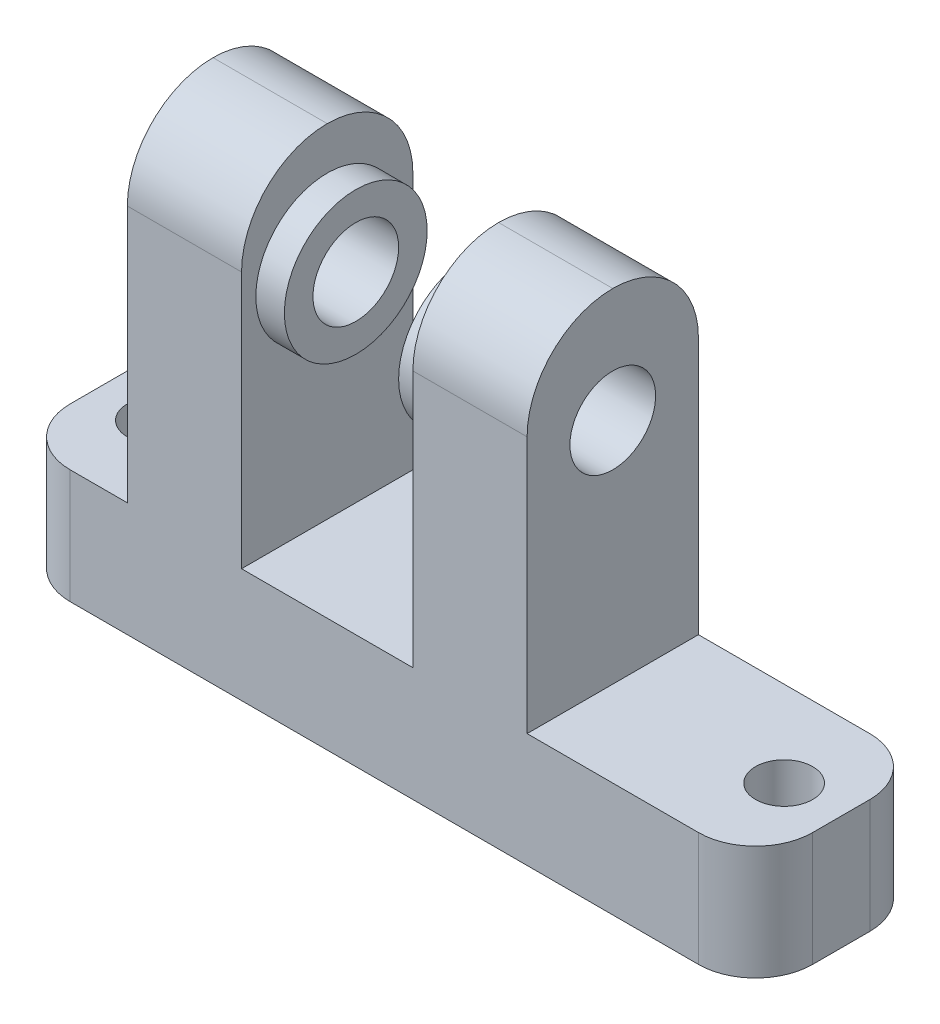
ISO-10303-21;
HEADER;
FILE_DESCRIPTION(('STEP AP214'),'2;1');
FILE_NAME('part.step','',(''),(''),'','','');
FILE_SCHEMA(('AUTOMOTIVE_DESIGN { 1 0 10303 214 1 1 1 1 }'));
ENDSEC;
DATA;
#1=APPLICATION_CONTEXT('core data for automotive mechanical design processes');
#2=APPLICATION_PROTOCOL_DEFINITION('international standard','automotive_design',2000,#1);
#3=PRODUCT_CONTEXT('',#1,'mechanical');
#4=PRODUCT('Part','Part','',(#3));
#5=PRODUCT_RELATED_PRODUCT_CATEGORY('part','',(#4));
#6=PRODUCT_DEFINITION_FORMATION('','',#4);
#7=PRODUCT_DEFINITION_CONTEXT('part definition',#1,'design');
#8=PRODUCT_DEFINITION('design','',#6,#7);
#9=PRODUCT_DEFINITION_SHAPE('','',#8);
#10=(LENGTH_UNIT() NAMED_UNIT(*) SI_UNIT(.MILLI.,.METRE.));
#11=(NAMED_UNIT(*) PLANE_ANGLE_UNIT() SI_UNIT($,.RADIAN.));
#12=(NAMED_UNIT(*) SI_UNIT($,.STERADIAN.) SOLID_ANGLE_UNIT());
#13=UNCERTAINTY_MEASURE_WITH_UNIT(LENGTH_MEASURE(1.E-05),#10,'distance_accuracy_value','');
#14=(GEOMETRIC_REPRESENTATION_CONTEXT(3) GLOBAL_UNCERTAINTY_ASSIGNED_CONTEXT((#13)) GLOBAL_UNIT_ASSIGNED_CONTEXT((#10,
#11,#12)) REPRESENTATION_CONTEXT('',''));
#15=CARTESIAN_POINT('',(0.,0.,0.));
#16=DIRECTION('',(0.,0.,1.));
#17=DIRECTION('',(1.,0.,0.));
#18=AXIS2_PLACEMENT_3D('',#15,#16,#17);
#19=CARTESIAN_POINT('',(-7.,4.,-3.));
#20=DIRECTION('',(1.,0.,0.));
#21=DIRECTION('',(0.,0.,-1.));
#22=AXIS2_PLACEMENT_3D('',#19,#20,#21);
#23=PLANE('',#22);
#24=CARTESIAN_POINT('',(-7.,12.,0.));
#25=DIRECTION('',(1.,0.,0.));
#26=DIRECTION('',(0.,0.,-1.));
#27=AXIS2_PLACEMENT_3D('',#24,#25,#26);
#28=CIRCLE('',#27,1.5);
#29=CARTESIAN_POINT('',(-7.,12.,-1.5));
#30=VERTEX_POINT('',#29);
#31=EDGE_CURVE('E234',#30,#30,#28,.T.);
#32=ORIENTED_EDGE('',*,*,#31,.T.);
#33=EDGE_LOOP('',(#32));
#34=FACE_BOUND('',#33,.T.);
#35=CARTESIAN_POINT('',(-7.,13.,0.));
#36=DIRECTION('',(1.,0.,0.));
#37=DIRECTION('',(0.,0.,-1.));
#38=AXIS2_PLACEMENT_3D('',#35,#36,#37);
#39=CIRCLE('',#38,3.);
#40=CARTESIAN_POINT('',(-7.,13.,3.));
#41=VERTEX_POINT('',#40);
#42=CARTESIAN_POINT('',(-7.,16.,0.));
#43=VERTEX_POINT('',#42);
#44=EDGE_CURVE('E309',#41,#43,#39,.F.);
#45=ORIENTED_EDGE('',*,*,#44,.T.);
#46=CARTESIAN_POINT('',(-7.,13.,0.));
#47=DIRECTION('',(1.,0.,0.));
#48=DIRECTION('',(0.,0.,-1.));
#49=AXIS2_PLACEMENT_3D('',#46,#47,#48);
#50=CIRCLE('',#49,3.);
#51=CARTESIAN_POINT('',(-7.,13.,-3.));
#52=VERTEX_POINT('',#51);
#53=EDGE_CURVE('E166',#43,#52,#50,.F.);
#54=ORIENTED_EDGE('',*,*,#53,.T.);
#55=DIRECTION('',(0.,-1.,0.));
#56=VECTOR('',#55,1.);
#57=CARTESIAN_POINT('',(-7.,4.,-3.));
#58=LINE('',#57,#56);
#59=CARTESIAN_POINT('',(-7.,4.,-3.));
#60=VERTEX_POINT('',#59);
#61=EDGE_CURVE('E160',#52,#60,#58,.T.);
#62=ORIENTED_EDGE('',*,*,#61,.T.);
#63=DIRECTION('',(0.,0.,-1.));
#64=VECTOR('',#63,1.);
#65=CARTESIAN_POINT('',(-7.,4.,3.));
#66=LINE('',#65,#64);
#67=CARTESIAN_POINT('',(-7.,4.,3.));
#68=VERTEX_POINT('',#67);
#69=EDGE_CURVE('E164',#68,#60,#66,.T.);
#70=ORIENTED_EDGE('',*,*,#69,.F.);
#71=DIRECTION('',(0.,-1.,0.));
#72=VECTOR('',#71,1.);
#73=CARTESIAN_POINT('',(-7.,4.,3.));
#74=LINE('',#73,#72);
#75=EDGE_CURVE('E171',#41,#68,#74,.T.);
#76=ORIENTED_EDGE('',*,*,#75,.F.);
#77=EDGE_LOOP('',(#45,#54,#62,#70,#76));
#78=FACE_BOUND('',#77,.T.);
#79=ADVANCED_FACE('F36',(#34,#78),#23,.F.);
#80=CARTESIAN_POINT('',(7.,4.,-3.));
#81=DIRECTION('',(-1.,0.,0.));
#82=DIRECTION('',(0.,0.,1.));
#83=AXIS2_PLACEMENT_3D('',#80,#81,#82);
#84=PLANE('',#83);
#85=CARTESIAN_POINT('',(7.,12.,0.));
#86=DIRECTION('',(-1.,0.,0.));
#87=DIRECTION('',(0.,0.,1.));
#88=AXIS2_PLACEMENT_3D('',#85,#86,#87);
#89=CIRCLE('',#88,1.5);
#90=CARTESIAN_POINT('',(7.,12.,1.5));
#91=VERTEX_POINT('',#90);
#92=EDGE_CURVE('E237',#91,#91,#89,.T.);
#93=ORIENTED_EDGE('',*,*,#92,.T.);
#94=EDGE_LOOP('',(#93));
#95=FACE_BOUND('',#94,.T.);
#96=DIRECTION('',(0.,-1.,0.));
#97=VECTOR('',#96,1.);
#98=CARTESIAN_POINT('',(7.,4.,-3.));
#99=LINE('',#98,#97);
#100=CARTESIAN_POINT('',(7.,13.,-3.));
#101=VERTEX_POINT('',#100);
#102=CARTESIAN_POINT('',(7.,4.,-3.));
#103=VERTEX_POINT('',#102);
#104=EDGE_CURVE('E170',#101,#103,#99,.T.);
#105=ORIENTED_EDGE('',*,*,#104,.F.);
#106=CARTESIAN_POINT('',(7.,13.,0.));
#107=DIRECTION('',(-1.,0.,0.));
#108=DIRECTION('',(0.,0.,1.));
#109=AXIS2_PLACEMENT_3D('',#106,#107,#108);
#110=CIRCLE('',#109,3.);
#111=CARTESIAN_POINT('',(7.,16.,0.));
#112=VERTEX_POINT('',#111);
#113=EDGE_CURVE('E58',#101,#112,#110,.F.);
#114=ORIENTED_EDGE('',*,*,#113,.T.);
#115=CARTESIAN_POINT('',(7.,13.,0.));
#116=DIRECTION('',(-1.,0.,0.));
#117=DIRECTION('',(0.,0.,1.));
#118=AXIS2_PLACEMENT_3D('',#115,#116,#117);
#119=CIRCLE('',#118,3.);
#120=CARTESIAN_POINT('',(7.,13.,3.));
#121=VERTEX_POINT('',#120);
#122=EDGE_CURVE('E53',#112,#121,#119,.F.);
#123=ORIENTED_EDGE('',*,*,#122,.T.);
#124=DIRECTION('',(0.,-1.,0.));
#125=VECTOR('',#124,1.);
#126=CARTESIAN_POINT('',(7.,4.,3.));
#127=LINE('',#126,#125);
#128=CARTESIAN_POINT('',(7.,4.,3.));
#129=VERTEX_POINT('',#128);
#130=EDGE_CURVE('E262',#121,#129,#127,.T.);
#131=ORIENTED_EDGE('',*,*,#130,.T.);
#132=DIRECTION('',(0.,0.,1.));
#133=VECTOR('',#132,1.);
#134=CARTESIAN_POINT('',(7.,4.,-3.));
#135=LINE('',#134,#133);
#136=EDGE_CURVE('E205',#103,#129,#135,.T.);
#137=ORIENTED_EDGE('',*,*,#136,.F.);
#138=EDGE_LOOP('',(#105,#114,#123,#131,#137));
#139=FACE_BOUND('',#138,.T.);
#140=ADVANCED_FACE('F400',(#95,#139),#84,.F.);
#141=CARTESIAN_POINT('',(3.,16.,3.));
#142=DIRECTION('',(1.,0.,0.));
#143=DIRECTION('',(0.,0.,-1.));
#144=AXIS2_PLACEMENT_3D('',#141,#142,#143);
#145=PLANE('',#144);
#146=CARTESIAN_POINT('',(3.,13.,0.));
#147=DIRECTION('',(1.,0.,0.));
#148=DIRECTION('',(0.,0.,-1.));
#149=AXIS2_PLACEMENT_3D('',#146,#147,#148);
#150=CIRCLE('',#149,3.);
#151=CARTESIAN_POINT('',(3.,13.,3.));
#152=VERTEX_POINT('',#151);
#153=CARTESIAN_POINT('',(3.,16.,0.));
#154=VERTEX_POINT('',#153);
#155=EDGE_CURVE('E321',#152,#154,#150,.F.);
#156=ORIENTED_EDGE('',*,*,#155,.T.);
#157=CARTESIAN_POINT('',(3.,13.,0.));
#158=DIRECTION('',(1.,0.,0.));
#159=DIRECTION('',(0.,0.,-1.));
#160=AXIS2_PLACEMENT_3D('',#157,#158,#159);
#161=CIRCLE('',#160,3.);
#162=CARTESIAN_POINT('',(3.,13.,-3.));
#163=VERTEX_POINT('',#162);
#164=EDGE_CURVE('E323',#154,#163,#161,.F.);
#165=ORIENTED_EDGE('',*,*,#164,.T.);
#166=DIRECTION('',(0.,-1.,0.));
#167=VECTOR('',#166,1.);
#168=CARTESIAN_POINT('',(3.,16.,-3.));
#169=LINE('',#168,#167);
#170=CARTESIAN_POINT('',(3.,4.,-3.));
#171=VERTEX_POINT('',#170);
#172=EDGE_CURVE('E240',#163,#171,#169,.T.);
#173=ORIENTED_EDGE('',*,*,#172,.T.);
#174=DIRECTION('',(0.,0.,1.));
#175=VECTOR('',#174,1.);
#176=CARTESIAN_POINT('',(3.,4.,3.));
#177=LINE('',#176,#175);
#178=CARTESIAN_POINT('',(3.,4.,3.));
#179=VERTEX_POINT('',#178);
#180=EDGE_CURVE('E244',#171,#179,#177,.T.);
#181=ORIENTED_EDGE('',*,*,#180,.T.);
#182=DIRECTION('',(0.,-1.,0.));
#183=VECTOR('',#182,1.);
#184=CARTESIAN_POINT('',(3.,16.,3.));
#185=LINE('',#184,#183);
#186=EDGE_CURVE('E242',#152,#179,#185,.T.);
#187=ORIENTED_EDGE('',*,*,#186,.F.);
#188=EDGE_LOOP('',(#156,#165,#173,#181,#187));
#189=FACE_BOUND('',#188,.T.);
#190=CARTESIAN_POINT('',(3.,12.,0.));
#191=DIRECTION('',(1.,0.,0.));
#192=DIRECTION('',(0.,0.,-1.));
#193=AXIS2_PLACEMENT_3D('',#190,#191,#192);
#194=CIRCLE('',#193,2.5);
#195=CARTESIAN_POINT('',(3.,12.,-2.5));
#196=VERTEX_POINT('',#195);
#197=EDGE_CURVE('E272',#196,#196,#194,.F.);
#198=ORIENTED_EDGE('',*,*,#197,.F.);
#199=EDGE_LOOP('',(#198));
#200=FACE_BOUND('',#199,.T.);
#201=ADVANCED_FACE('F345',(#189,#200),#145,.F.);
#202=CARTESIAN_POINT('',(-3.,16.,3.));
#203=DIRECTION('',(-1.,0.,0.));
#204=DIRECTION('',(0.,0.,1.));
#205=AXIS2_PLACEMENT_3D('',#202,#203,#204);
#206=PLANE('',#205);
#207=DIRECTION('',(0.,-1.,0.));
#208=VECTOR('',#207,1.);
#209=CARTESIAN_POINT('',(-3.,16.,-3.));
#210=LINE('',#209,#208);
#211=CARTESIAN_POINT('',(-3.,13.,-3.));
#212=VERTEX_POINT('',#211);
#213=CARTESIAN_POINT('',(-3.,4.,-3.));
#214=VERTEX_POINT('',#213);
#215=EDGE_CURVE('E250',#212,#214,#210,.T.);
#216=ORIENTED_EDGE('',*,*,#215,.F.);
#217=CARTESIAN_POINT('',(-3.,13.,0.));
#218=DIRECTION('',(-1.,0.,0.));
#219=DIRECTION('',(0.,0.,1.));
#220=AXIS2_PLACEMENT_3D('',#217,#218,#219);
#221=CIRCLE('',#220,3.);
#222=CARTESIAN_POINT('',(-3.,16.,0.));
#223=VERTEX_POINT('',#222);
#224=EDGE_CURVE('E319',#212,#223,#221,.F.);
#225=ORIENTED_EDGE('',*,*,#224,.T.);
#226=CARTESIAN_POINT('',(-3.,13.,0.));
#227=DIRECTION('',(-1.,0.,0.));
#228=DIRECTION('',(0.,0.,1.));
#229=AXIS2_PLACEMENT_3D('',#226,#227,#228);
#230=CIRCLE('',#229,3.);
#231=CARTESIAN_POINT('',(-3.,13.,3.));
#232=VERTEX_POINT('',#231);
#233=EDGE_CURVE('E317',#223,#232,#230,.F.);
#234=ORIENTED_EDGE('',*,*,#233,.T.);
#235=DIRECTION('',(0.,-1.,0.));
#236=VECTOR('',#235,1.);
#237=CARTESIAN_POINT('',(-3.,16.,3.));
#238=LINE('',#237,#236);
#239=CARTESIAN_POINT('',(-3.,4.,3.));
#240=VERTEX_POINT('',#239);
#241=EDGE_CURVE('E252',#232,#240,#238,.T.);
#242=ORIENTED_EDGE('',*,*,#241,.T.);
#243=DIRECTION('',(0.,0.,-1.));
#244=VECTOR('',#243,1.);
#245=CARTESIAN_POINT('',(-3.,4.,3.));
#246=LINE('',#245,#244);
#247=EDGE_CURVE('E247',#240,#214,#246,.T.);
#248=ORIENTED_EDGE('',*,*,#247,.T.);
#249=EDGE_LOOP('',(#216,#225,#234,#242,#248));
#250=FACE_BOUND('',#249,.T.);
#251=CARTESIAN_POINT('',(-3.,12.,0.));
#252=DIRECTION('',(-1.,0.,0.));
#253=DIRECTION('',(0.,0.,1.));
#254=AXIS2_PLACEMENT_3D('',#251,#252,#253);
#255=CIRCLE('',#254,2.5);
#256=CARTESIAN_POINT('',(-3.,12.,2.5));
#257=VERTEX_POINT('',#256);
#258=EDGE_CURVE('E269',#257,#257,#255,.F.);
#259=ORIENTED_EDGE('',*,*,#258,.F.);
#260=EDGE_LOOP('',(#259));
#261=FACE_BOUND('',#260,.T.);
#262=ADVANCED_FACE('F355',(#250,#261),#206,.F.);
#263=CARTESIAN_POINT('',(0.,4.,0.));
#264=DIRECTION('',(0.,1.,0.));
#265=DIRECTION('',(0.,0.,1.));
#266=AXIS2_PLACEMENT_3D('',#263,#264,#265);
#267=PLANE('',#266);
#268=DIRECTION('',(1.,0.,0.));
#269=VECTOR('',#268,1.);
#270=CARTESIAN_POINT('',(-7.,4.,3.));
#271=LINE('',#270,#269);
#272=EDGE_CURVE('E258',#240,#179,#271,.T.);
#273=ORIENTED_EDGE('',*,*,#272,.T.);
#274=ORIENTED_EDGE('',*,*,#180,.F.);
#275=DIRECTION('',(-1.,0.,0.));
#276=VECTOR('',#275,1.);
#277=CARTESIAN_POINT('',(-7.,4.,-3.));
#278=LINE('',#277,#276);
#279=EDGE_CURVE('E255',#171,#214,#278,.T.);
#280=ORIENTED_EDGE('',*,*,#279,.T.);
#281=ORIENTED_EDGE('',*,*,#247,.F.);
#282=EDGE_LOOP('',(#273,#274,#280,#281));
#283=FACE_BOUND('',#282,.T.);
#284=ADVANCED_FACE('F351',(#283),#267,.T.);
#285=CARTESIAN_POINT('',(-7.,4.,-3.));
#286=DIRECTION('',(0.,0.,1.));
#287=DIRECTION('',(1.,0.,0.));
#288=AXIS2_PLACEMENT_3D('',#285,#286,#287);
#289=PLANE('',#288);
#290=ORIENTED_EDGE('',*,*,#61,.F.);
#291=DIRECTION('',(-1.,0.,0.));
#292=VECTOR('',#291,1.);
#293=CARTESIAN_POINT('',(-3.,13.,-3.));
#294=LINE('',#293,#292);
#295=EDGE_CURVE('E315',#52,#212,#294,.F.);
#296=ORIENTED_EDGE('',*,*,#295,.T.);
#297=ORIENTED_EDGE('',*,*,#215,.T.);
#298=ORIENTED_EDGE('',*,*,#279,.F.);
#299=ORIENTED_EDGE('',*,*,#172,.F.);
#300=DIRECTION('',(-1.,0.,0.));
#301=VECTOR('',#300,1.);
#302=CARTESIAN_POINT('',(-7.,13.,-3.));
#303=LINE('',#302,#301);
#304=EDGE_CURVE('E312',#163,#101,#303,.F.);
#305=ORIENTED_EDGE('',*,*,#304,.T.);
#306=ORIENTED_EDGE('',*,*,#104,.T.);
#307=DIRECTION('',(-1.,0.,0.));
#308=VECTOR('',#307,1.);
#309=CARTESIAN_POINT('',(15.,4.,-3.));
#310=LINE('',#309,#308);
#311=CARTESIAN_POINT('',(13.,4.,-3.));
#312=VERTEX_POINT('',#311);
#313=EDGE_CURVE('E212',#312,#103,#310,.T.);
#314=ORIENTED_EDGE('',*,*,#313,.F.);
#315=DIRECTION('',(0.,1.,0.));
#316=VECTOR('',#315,1.);
#317=CARTESIAN_POINT('',(13.,0.,-3.));
#318=LINE('',#317,#316);
#319=CARTESIAN_POINT('',(13.,0.,-3.));
#320=VERTEX_POINT('',#319);
#321=EDGE_CURVE('E285',#312,#320,#318,.F.);
#322=ORIENTED_EDGE('',*,*,#321,.T.);
#323=DIRECTION('',(-1.,0.,0.));
#324=VECTOR('',#323,1.);
#325=CARTESIAN_POINT('',(-7.,0.,-3.));
#326=LINE('',#325,#324);
#327=CARTESIAN_POINT('',(-9.,0.,-3.));
#328=VERTEX_POINT('',#327);
#329=EDGE_CURVE('E254',#320,#328,#326,.T.);
#330=ORIENTED_EDGE('',*,*,#329,.T.);
#331=DIRECTION('',(0.,1.,0.));
#332=VECTOR('',#331,1.);
#333=CARTESIAN_POINT('',(-9.,4.,-3.));
#334=LINE('',#333,#332);
#335=CARTESIAN_POINT('',(-9.,4.,-3.));
#336=VERTEX_POINT('',#335);
#337=EDGE_CURVE('E179',#328,#336,#334,.T.);
#338=ORIENTED_EDGE('',*,*,#337,.T.);
#339=DIRECTION('',(-1.,0.,0.));
#340=VECTOR('',#339,1.);
#341=CARTESIAN_POINT('',(-7.,4.,-3.));
#342=LINE('',#341,#340);
#343=EDGE_CURVE('E175',#60,#336,#342,.T.);
#344=ORIENTED_EDGE('',*,*,#343,.F.);
#345=EDGE_LOOP('',(#290,#296,#297,#298,#299,#305,#306,#314,#322,#330,#338,#344));
#346=FACE_BOUND('',#345,.T.);
#347=ADVANCED_FACE('F176',(#346),#289,.F.);
#348=CARTESIAN_POINT('',(-7.,4.,3.));
#349=DIRECTION('',(0.,0.,-1.));
#350=DIRECTION('',(-1.,0.,0.));
#351=AXIS2_PLACEMENT_3D('',#348,#349,#350);
#352=PLANE('',#351);
#353=ORIENTED_EDGE('',*,*,#130,.F.);
#354=DIRECTION('',(1.,0.,0.));
#355=VECTOR('',#354,1.);
#356=CARTESIAN_POINT('',(-7.,13.,3.));
#357=LINE('',#356,#355);
#358=EDGE_CURVE('E11',#121,#152,#357,.F.);
#359=ORIENTED_EDGE('',*,*,#358,.T.);
#360=ORIENTED_EDGE('',*,*,#186,.T.);
#361=ORIENTED_EDGE('',*,*,#272,.F.);
#362=ORIENTED_EDGE('',*,*,#241,.F.);
#363=DIRECTION('',(1.,0.,0.));
#364=VECTOR('',#363,1.);
#365=CARTESIAN_POINT('',(-7.,13.,3.));
#366=LINE('',#365,#364);
#367=EDGE_CURVE('E45',#232,#41,#366,.F.);
#368=ORIENTED_EDGE('',*,*,#367,.T.);
#369=ORIENTED_EDGE('',*,*,#75,.T.);
#370=DIRECTION('',(1.,0.,0.));
#371=VECTOR('',#370,1.);
#372=CARTESIAN_POINT('',(-11.,4.,3.));
#373=LINE('',#372,#371);
#374=CARTESIAN_POINT('',(-9.,4.,3.));
#375=VERTEX_POINT('',#374);
#376=EDGE_CURVE('E186',#375,#68,#373,.T.);
#377=ORIENTED_EDGE('',*,*,#376,.F.);
#378=DIRECTION('',(0.,1.,0.));
#379=VECTOR('',#378,1.);
#380=CARTESIAN_POINT('',(-9.,0.,3.));
#381=LINE('',#380,#379);
#382=CARTESIAN_POINT('',(-9.,0.,3.));
#383=VERTEX_POINT('',#382);
#384=EDGE_CURVE('E307',#375,#383,#381,.F.);
#385=ORIENTED_EDGE('',*,*,#384,.T.);
#386=DIRECTION('',(1.,0.,0.));
#387=VECTOR('',#386,1.);
#388=CARTESIAN_POINT('',(-7.,0.,3.));
#389=LINE('',#388,#387);
#390=CARTESIAN_POINT('',(13.,0.,3.));
#391=VERTEX_POINT('',#390);
#392=EDGE_CURVE('E259',#383,#391,#389,.T.);
#393=ORIENTED_EDGE('',*,*,#392,.T.);
#394=DIRECTION('',(0.,1.,0.));
#395=VECTOR('',#394,1.);
#396=CARTESIAN_POINT('',(13.,4.,3.));
#397=LINE('',#396,#395);
#398=CARTESIAN_POINT('',(13.,4.,3.));
#399=VERTEX_POINT('',#398);
#400=EDGE_CURVE('E304',#391,#399,#397,.T.);
#401=ORIENTED_EDGE('',*,*,#400,.T.);
#402=DIRECTION('',(1.,0.,0.));
#403=VECTOR('',#402,1.);
#404=CARTESIAN_POINT('',(15.,4.,3.));
#405=LINE('',#404,#403);
#406=EDGE_CURVE('E215',#129,#399,#405,.T.);
#407=ORIENTED_EDGE('',*,*,#406,.F.);
#408=EDGE_LOOP('',(#353,#359,#360,#361,#362,#368,#369,#377,#385,#393,#401,#407));
#409=FACE_BOUND('',#408,.T.);
#410=ADVANCED_FACE('F341',(#409),#352,.F.);
#411=CARTESIAN_POINT('',(0.,0.,0.));
#412=DIRECTION('',(0.,1.,0.));
#413=DIRECTION('',(0.,0.,1.));
#414=AXIS2_PLACEMENT_3D('',#411,#412,#413);
#415=PLANE('',#414);
#416=ORIENTED_EDGE('',*,*,#329,.F.);
#417=CARTESIAN_POINT('',(13.,0.,-1.));
#418=DIRECTION('',(0.,1.,0.));
#419=DIRECTION('',(0.,0.,1.));
#420=AXIS2_PLACEMENT_3D('',#417,#418,#419);
#421=CIRCLE('',#420,2.);
#422=CARTESIAN_POINT('',(15.,0.,-1.));
#423=VERTEX_POINT('',#422);
#424=EDGE_CURVE('E293',#320,#423,#421,.F.);
#425=ORIENTED_EDGE('',*,*,#424,.T.);
#426=DIRECTION('',(0.,0.,-1.));
#427=VECTOR('',#426,1.);
#428=CARTESIAN_POINT('',(15.,0.,-3.));
#429=LINE('',#428,#427);
#430=CARTESIAN_POINT('',(15.,0.,1.));
#431=VERTEX_POINT('',#430);
#432=EDGE_CURVE('E208',#431,#423,#429,.T.);
#433=ORIENTED_EDGE('',*,*,#432,.F.);
#434=CARTESIAN_POINT('',(13.,0.,1.));
#435=DIRECTION('',(0.,1.,0.));
#436=DIRECTION('',(0.,0.,1.));
#437=AXIS2_PLACEMENT_3D('',#434,#435,#436);
#438=CIRCLE('',#437,2.);
#439=EDGE_CURVE('E287',#431,#391,#438,.F.);
#440=ORIENTED_EDGE('',*,*,#439,.T.);
#441=ORIENTED_EDGE('',*,*,#392,.F.);
#442=CARTESIAN_POINT('',(-9.,0.,1.));
#443=DIRECTION('',(0.,1.,0.));
#444=DIRECTION('',(0.,0.,1.));
#445=AXIS2_PLACEMENT_3D('',#442,#443,#444);
#446=CIRCLE('',#445,2.);
#447=CARTESIAN_POINT('',(-11.,0.,1.));
#448=VERTEX_POINT('',#447);
#449=EDGE_CURVE('E289',#383,#448,#446,.F.);
#450=ORIENTED_EDGE('',*,*,#449,.T.);
#451=DIRECTION('',(0.,0.,1.));
#452=VECTOR('',#451,1.);
#453=CARTESIAN_POINT('',(-11.,0.,-3.));
#454=LINE('',#453,#452);
#455=CARTESIAN_POINT('',(-11.,0.,-1.));
#456=VERTEX_POINT('',#455);
#457=EDGE_CURVE('E192',#456,#448,#454,.T.);
#458=ORIENTED_EDGE('',*,*,#457,.F.);
#459=CARTESIAN_POINT('',(-9.,0.,-1.));
#460=DIRECTION('',(0.,1.,0.));
#461=DIRECTION('',(0.,0.,1.));
#462=AXIS2_PLACEMENT_3D('',#459,#460,#461);
#463=CIRCLE('',#462,2.);
#464=EDGE_CURVE('E291',#456,#328,#463,.F.);
#465=ORIENTED_EDGE('',*,*,#464,.T.);
#466=EDGE_LOOP('',(#416,#425,#433,#440,#441,#450,#458,#465));
#467=FACE_BOUND('',#466,.T.);
#468=CARTESIAN_POINT('',(13.,0.,0.));
#469=DIRECTION('',(0.,1.,0.));
#470=DIRECTION('',(0.,0.,1.));
#471=AXIS2_PLACEMENT_3D('',#468,#469,#470);
#472=CIRCLE('',#471,1.);
#473=CARTESIAN_POINT('',(13.,0.,1.));
#474=VERTEX_POINT('',#473);
#475=EDGE_CURVE('E202',#474,#474,#472,.T.);
#476=ORIENTED_EDGE('',*,*,#475,.T.);
#477=EDGE_LOOP('',(#476));
#478=FACE_BOUND('',#477,.T.);
#479=CARTESIAN_POINT('',(-9.,0.,0.));
#480=DIRECTION('',(0.,1.,0.));
#481=DIRECTION('',(0.,0.,1.));
#482=AXIS2_PLACEMENT_3D('',#479,#480,#481);
#483=CIRCLE('',#482,1.);
#484=CARTESIAN_POINT('',(-9.,0.,1.));
#485=VERTEX_POINT('',#484);
#486=EDGE_CURVE('E188',#485,#485,#483,.T.);
#487=ORIENTED_EDGE('',*,*,#486,.T.);
#488=EDGE_LOOP('',(#487));
#489=FACE_BOUND('',#488,.T.);
#490=ADVANCED_FACE('F372',(#467,#478,#489),#415,.F.);
#491=CARTESIAN_POINT('',(-7.,12.,0.));
#492=DIRECTION('',(1.,0.,0.));
#493=DIRECTION('',(0.,0.,-1.));
#494=AXIS2_PLACEMENT_3D('',#491,#492,#493);
#495=CYLINDRICAL_SURFACE('',#494,1.5);
#496=ORIENTED_EDGE('',*,*,#92,.F.);
#497=EDGE_LOOP('',(#496));
#498=FACE_BOUND('',#497,.T.);
#499=CARTESIAN_POINT('',(2.,12.,0.));
#500=DIRECTION('',(-1.,0.,0.));
#501=DIRECTION('',(0.,0.,1.));
#502=AXIS2_PLACEMENT_3D('',#499,#500,#501);
#503=CIRCLE('',#502,1.5);
#504=CARTESIAN_POINT('',(2.,12.,1.5));
#505=VERTEX_POINT('',#504);
#506=EDGE_CURVE('E211',#505,#505,#503,.T.);
#507=ORIENTED_EDGE('',*,*,#506,.T.);
#508=EDGE_LOOP('',(#507));
#509=FACE_BOUND('',#508,.T.);
#510=ADVANCED_FACE('F540',(#498,#509),#495,.F.);
#511=ORIENTED_EDGE('',*,*,#31,.F.);
#512=EDGE_LOOP('',(#511));
#513=FACE_BOUND('',#512,.T.);
#514=CARTESIAN_POINT('',(-2.,12.,0.));
#515=DIRECTION('',(1.,0.,0.));
#516=DIRECTION('',(0.,0.,-1.));
#517=AXIS2_PLACEMENT_3D('',#514,#515,#516);
#518=CIRCLE('',#517,1.5);
#519=CARTESIAN_POINT('',(-2.,12.,-1.5));
#520=VERTEX_POINT('',#519);
#521=EDGE_CURVE('E228',#520,#520,#518,.T.);
#522=ORIENTED_EDGE('',*,*,#521,.T.);
#523=EDGE_LOOP('',(#522));
#524=FACE_BOUND('',#523,.T.);
#525=ADVANCED_FACE('F532',(#513,#524),#495,.F.);
#526=CARTESIAN_POINT('',(-2.,12.,0.));
#527=DIRECTION('',(1.,0.,0.));
#528=DIRECTION('',(0.,0.,-1.));
#529=AXIS2_PLACEMENT_3D('',#526,#527,#528);
#530=PLANE('',#529);
#531=CARTESIAN_POINT('',(-2.,12.,0.));
#532=DIRECTION('',(1.,0.,0.));
#533=DIRECTION('',(0.,0.,-1.));
#534=AXIS2_PLACEMENT_3D('',#531,#532,#533);
#535=CIRCLE('',#534,2.5);
#536=CARTESIAN_POINT('',(-2.,12.,-2.5));
#537=VERTEX_POINT('',#536);
#538=EDGE_CURVE('E231',#537,#537,#535,.T.);
#539=ORIENTED_EDGE('',*,*,#538,.T.);
#540=EDGE_LOOP('',(#539));
#541=FACE_BOUND('',#540,.T.);
#542=ORIENTED_EDGE('',*,*,#521,.F.);
#543=EDGE_LOOP('',(#542));
#544=FACE_BOUND('',#543,.T.);
#545=ADVANCED_FACE('F524',(#541,#544),#530,.T.);
#546=CARTESIAN_POINT('',(-2.,12.,0.));
#547=DIRECTION('',(-1.,0.,0.));
#548=DIRECTION('',(0.,0.,1.));
#549=AXIS2_PLACEMENT_3D('',#546,#547,#548);
#550=CYLINDRICAL_SURFACE('',#549,2.5);
#551=ORIENTED_EDGE('',*,*,#538,.F.);
#552=EDGE_LOOP('',(#551));
#553=FACE_BOUND('',#552,.T.);
#554=ORIENTED_EDGE('',*,*,#258,.T.);
#555=EDGE_LOOP('',(#554));
#556=FACE_BOUND('',#555,.T.);
#557=ADVANCED_FACE('F515',(#553,#556),#550,.T.);
#558=CARTESIAN_POINT('',(2.,12.,0.));
#559=DIRECTION('',(-1.,0.,0.));
#560=DIRECTION('',(0.,0.,1.));
#561=AXIS2_PLACEMENT_3D('',#558,#559,#560);
#562=PLANE('',#561);
#563=CARTESIAN_POINT('',(2.,12.,0.));
#564=DIRECTION('',(-1.,0.,0.));
#565=DIRECTION('',(0.,0.,1.));
#566=AXIS2_PLACEMENT_3D('',#563,#564,#565);
#567=CIRCLE('',#566,2.5);
#568=CARTESIAN_POINT('',(2.,12.,2.5));
#569=VERTEX_POINT('',#568);
#570=EDGE_CURVE('E225',#569,#569,#567,.T.);
#571=ORIENTED_EDGE('',*,*,#570,.T.);
#572=EDGE_LOOP('',(#571));
#573=FACE_BOUND('',#572,.T.);
#574=ORIENTED_EDGE('',*,*,#506,.F.);
#575=EDGE_LOOP('',(#574));
#576=FACE_BOUND('',#575,.T.);
#577=ADVANCED_FACE('F507',(#573,#576),#562,.T.);
#578=CARTESIAN_POINT('',(2.,12.,0.));
#579=DIRECTION('',(1.,0.,0.));
#580=DIRECTION('',(0.,0.,-1.));
#581=AXIS2_PLACEMENT_3D('',#578,#579,#580);
#582=CYLINDRICAL_SURFACE('',#581,2.5);
#583=ORIENTED_EDGE('',*,*,#570,.F.);
#584=EDGE_LOOP('',(#583));
#585=FACE_BOUND('',#584,.T.);
#586=ORIENTED_EDGE('',*,*,#197,.T.);
#587=EDGE_LOOP('',(#586));
#588=FACE_BOUND('',#587,.T.);
#589=ADVANCED_FACE('F501',(#585,#588),#582,.T.);
#590=CARTESIAN_POINT('',(15.,0.,-3.));
#591=DIRECTION('',(1.,0.,0.));
#592=DIRECTION('',(0.,0.,-1.));
#593=AXIS2_PLACEMENT_3D('',#590,#591,#592);
#594=PLANE('',#593);
#595=ORIENTED_EDGE('',*,*,#432,.T.);
#596=DIRECTION('',(0.,1.,0.));
#597=VECTOR('',#596,1.);
#598=CARTESIAN_POINT('',(15.,4.,-1.));
#599=LINE('',#598,#597);
#600=CARTESIAN_POINT('',(15.,4.,-1.));
#601=VERTEX_POINT('',#600);
#602=EDGE_CURVE('E277',#423,#601,#599,.T.);
#603=ORIENTED_EDGE('',*,*,#602,.T.);
#604=DIRECTION('',(0.,0.,-1.));
#605=VECTOR('',#604,1.);
#606=CARTESIAN_POINT('',(15.,4.,-3.));
#607=LINE('',#606,#605);
#608=CARTESIAN_POINT('',(15.,4.,1.));
#609=VERTEX_POINT('',#608);
#610=EDGE_CURVE('E218',#609,#601,#607,.T.);
#611=ORIENTED_EDGE('',*,*,#610,.F.);
#612=DIRECTION('',(0.,1.,0.));
#613=VECTOR('',#612,1.);
#614=CARTESIAN_POINT('',(15.,0.,1.));
#615=LINE('',#614,#613);
#616=EDGE_CURVE('E275',#609,#431,#615,.F.);
#617=ORIENTED_EDGE('',*,*,#616,.T.);
#618=EDGE_LOOP('',(#595,#603,#611,#617));
#619=FACE_BOUND('',#618,.T.);
#620=ADVANCED_FACE('F391',(#619),#594,.T.);
#621=CARTESIAN_POINT('',(0.,4.,0.));
#622=DIRECTION('',(0.,-1.,0.));
#623=DIRECTION('',(0.,0.,-1.));
#624=AXIS2_PLACEMENT_3D('',#621,#622,#623);
#625=PLANE('',#624);
#626=CARTESIAN_POINT('',(13.,4.,0.));
#627=DIRECTION('',(0.,1.,0.));
#628=DIRECTION('',(0.,0.,1.));
#629=AXIS2_PLACEMENT_3D('',#626,#627,#628);
#630=CIRCLE('',#629,1.);
#631=CARTESIAN_POINT('',(13.,4.,1.));
#632=VERTEX_POINT('',#631);
#633=EDGE_CURVE('E199',#632,#632,#630,.T.);
#634=ORIENTED_EDGE('',*,*,#633,.F.);
#635=EDGE_LOOP('',(#634));
#636=FACE_BOUND('',#635,.T.);
#637=ORIENTED_EDGE('',*,*,#610,.T.);
#638=CARTESIAN_POINT('',(13.,4.,-1.));
#639=DIRECTION('',(0.,-1.,0.));
#640=DIRECTION('',(0.,0.,-1.));
#641=AXIS2_PLACEMENT_3D('',#638,#639,#640);
#642=CIRCLE('',#641,2.);
#643=EDGE_CURVE('E282',#601,#312,#642,.F.);
#644=ORIENTED_EDGE('',*,*,#643,.T.);
#645=ORIENTED_EDGE('',*,*,#313,.T.);
#646=ORIENTED_EDGE('',*,*,#136,.T.);
#647=ORIENTED_EDGE('',*,*,#406,.T.);
#648=CARTESIAN_POINT('',(13.,4.,1.));
#649=DIRECTION('',(0.,-1.,0.));
#650=DIRECTION('',(0.,0.,-1.));
#651=AXIS2_PLACEMENT_3D('',#648,#649,#650);
#652=CIRCLE('',#651,2.);
#653=EDGE_CURVE('E280',#399,#609,#652,.F.);
#654=ORIENTED_EDGE('',*,*,#653,.T.);
#655=EDGE_LOOP('',(#637,#644,#645,#646,#647,#654));
#656=FACE_BOUND('',#655,.T.);
#657=ADVANCED_FACE('F398',(#636,#656),#625,.F.);
#658=CARTESIAN_POINT('',(13.,0.,0.));
#659=DIRECTION('',(0.,1.,0.));
#660=DIRECTION('',(0.,0.,1.));
#661=AXIS2_PLACEMENT_3D('',#658,#659,#660);
#662=CYLINDRICAL_SURFACE('',#661,1.);
#663=ORIENTED_EDGE('',*,*,#475,.F.);
#664=EDGE_LOOP('',(#663));
#665=FACE_BOUND('',#664,.T.);
#666=ORIENTED_EDGE('',*,*,#633,.T.);
#667=EDGE_LOOP('',(#666));
#668=FACE_BOUND('',#667,.T.);
#669=ADVANCED_FACE('F480',(#665,#668),#662,.F.);
#670=CARTESIAN_POINT('',(-11.,0.,-3.));
#671=DIRECTION('',(-1.,0.,0.));
#672=DIRECTION('',(0.,0.,1.));
#673=AXIS2_PLACEMENT_3D('',#670,#671,#672);
#674=PLANE('',#673);
#675=DIRECTION('',(0.,0.,1.));
#676=VECTOR('',#675,1.);
#677=CARTESIAN_POINT('',(-11.,4.,-3.));
#678=LINE('',#677,#676);
#679=CARTESIAN_POINT('',(-11.,4.,-1.));
#680=VERTEX_POINT('',#679);
#681=CARTESIAN_POINT('',(-11.,4.,1.));
#682=VERTEX_POINT('',#681);
#683=EDGE_CURVE('E181',#680,#682,#678,.T.);
#684=ORIENTED_EDGE('',*,*,#683,.F.);
#685=DIRECTION('',(0.,1.,0.));
#686=VECTOR('',#685,1.);
#687=CARTESIAN_POINT('',(-11.,0.,-1.));
#688=LINE('',#687,#686);
#689=EDGE_CURVE('E302',#680,#456,#688,.F.);
#690=ORIENTED_EDGE('',*,*,#689,.T.);
#691=ORIENTED_EDGE('',*,*,#457,.T.);
#692=DIRECTION('',(0.,1.,0.));
#693=VECTOR('',#692,1.);
#694=CARTESIAN_POINT('',(-11.,4.,1.));
#695=LINE('',#694,#693);
#696=EDGE_CURVE('E299',#448,#682,#695,.T.);
#697=ORIENTED_EDGE('',*,*,#696,.T.);
#698=EDGE_LOOP('',(#684,#690,#691,#697));
#699=FACE_BOUND('',#698,.T.);
#700=ADVANCED_FACE('F377',(#699),#674,.T.);
#701=CARTESIAN_POINT('',(0.,4.,0.));
#702=DIRECTION('',(0.,1.,0.));
#703=DIRECTION('',(0.,0.,1.));
#704=AXIS2_PLACEMENT_3D('',#701,#702,#703);
#705=PLANE('',#704);
#706=CARTESIAN_POINT('',(-9.,4.,0.));
#707=DIRECTION('',(0.,1.,0.));
#708=DIRECTION('',(0.,0.,1.));
#709=AXIS2_PLACEMENT_3D('',#706,#707,#708);
#710=CIRCLE('',#709,1.);
#711=CARTESIAN_POINT('',(-9.,4.,1.));
#712=VERTEX_POINT('',#711);
#713=EDGE_CURVE('E196',#712,#712,#710,.T.);
#714=ORIENTED_EDGE('',*,*,#713,.F.);
#715=EDGE_LOOP('',(#714));
#716=FACE_BOUND('',#715,.T.);
#717=ORIENTED_EDGE('',*,*,#343,.T.);
#718=CARTESIAN_POINT('',(-9.,4.,-1.));
#719=DIRECTION('',(0.,1.,0.));
#720=DIRECTION('',(0.,0.,1.));
#721=AXIS2_PLACEMENT_3D('',#718,#719,#720);
#722=CIRCLE('',#721,2.);
#723=EDGE_CURVE('E297',#336,#680,#722,.T.);
#724=ORIENTED_EDGE('',*,*,#723,.T.);
#725=ORIENTED_EDGE('',*,*,#683,.T.);
#726=CARTESIAN_POINT('',(-9.,4.,1.));
#727=DIRECTION('',(0.,1.,0.));
#728=DIRECTION('',(0.,0.,1.));
#729=AXIS2_PLACEMENT_3D('',#726,#727,#728);
#730=CIRCLE('',#729,2.);
#731=EDGE_CURVE('E295',#682,#375,#730,.T.);
#732=ORIENTED_EDGE('',*,*,#731,.T.);
#733=ORIENTED_EDGE('',*,*,#376,.T.);
#734=ORIENTED_EDGE('',*,*,#69,.T.);
#735=EDGE_LOOP('',(#717,#724,#725,#732,#733,#734));
#736=FACE_BOUND('',#735,.T.);
#737=ADVANCED_FACE('F184',(#716,#736),#705,.T.);
#738=CARTESIAN_POINT('',(-9.,0.,0.));
#739=DIRECTION('',(0.,1.,0.));
#740=DIRECTION('',(0.,0.,1.));
#741=AXIS2_PLACEMENT_3D('',#738,#739,#740);
#742=CYLINDRICAL_SURFACE('',#741,1.);
#743=ORIENTED_EDGE('',*,*,#486,.F.);
#744=EDGE_LOOP('',(#743));
#745=FACE_BOUND('',#744,.T.);
#746=ORIENTED_EDGE('',*,*,#713,.T.);
#747=EDGE_LOOP('',(#746));
#748=FACE_BOUND('',#747,.T.);
#749=ADVANCED_FACE('F415',(#745,#748),#742,.F.);
#750=CARTESIAN_POINT('',(13.,0.,-1.));
#751=DIRECTION('',(0.,-1.,0.));
#752=DIRECTION('',(0.,0.,-1.));
#753=AXIS2_PLACEMENT_3D('',#750,#751,#752);
#754=CYLINDRICAL_SURFACE('',#753,2.);
#755=ORIENTED_EDGE('',*,*,#424,.F.);
#756=ORIENTED_EDGE('',*,*,#321,.F.);
#757=ORIENTED_EDGE('',*,*,#643,.F.);
#758=ORIENTED_EDGE('',*,*,#602,.F.);
#759=EDGE_LOOP('',(#755,#756,#757,#758));
#760=FACE_BOUND('',#759,.T.);
#761=ADVANCED_FACE('F386',(#760),#754,.T.);
#762=CARTESIAN_POINT('',(-9.,4.,-1.));
#763=DIRECTION('',(0.,-1.,0.));
#764=DIRECTION('',(0.,0.,-1.));
#765=AXIS2_PLACEMENT_3D('',#762,#763,#764);
#766=CYLINDRICAL_SURFACE('',#765,2.);
#767=ORIENTED_EDGE('',*,*,#464,.F.);
#768=ORIENTED_EDGE('',*,*,#689,.F.);
#769=ORIENTED_EDGE('',*,*,#723,.F.);
#770=ORIENTED_EDGE('',*,*,#337,.F.);
#771=EDGE_LOOP('',(#767,#768,#769,#770));
#772=FACE_BOUND('',#771,.T.);
#773=ADVANCED_FACE('F381',(#772),#766,.T.);
#774=CARTESIAN_POINT('',(-9.,0.,1.));
#775=DIRECTION('',(0.,-1.,0.));
#776=DIRECTION('',(0.,0.,-1.));
#777=AXIS2_PLACEMENT_3D('',#774,#775,#776);
#778=CYLINDRICAL_SURFACE('',#777,2.);
#779=ORIENTED_EDGE('',*,*,#449,.F.);
#780=ORIENTED_EDGE('',*,*,#384,.F.);
#781=ORIENTED_EDGE('',*,*,#731,.F.);
#782=ORIENTED_EDGE('',*,*,#696,.F.);
#783=EDGE_LOOP('',(#779,#780,#781,#782));
#784=FACE_BOUND('',#783,.T.);
#785=ADVANCED_FACE('F367',(#784),#778,.T.);
#786=CARTESIAN_POINT('',(13.,4.,1.));
#787=DIRECTION('',(0.,-1.,0.));
#788=DIRECTION('',(0.,0.,-1.));
#789=AXIS2_PLACEMENT_3D('',#786,#787,#788);
#790=CYLINDRICAL_SURFACE('',#789,2.);
#791=ORIENTED_EDGE('',*,*,#439,.F.);
#792=ORIENTED_EDGE('',*,*,#616,.F.);
#793=ORIENTED_EDGE('',*,*,#653,.F.);
#794=ORIENTED_EDGE('',*,*,#400,.F.);
#795=EDGE_LOOP('',(#791,#792,#793,#794));
#796=FACE_BOUND('',#795,.T.);
#797=ADVANCED_FACE('F395',(#796),#790,.T.);
#798=CARTESIAN_POINT('',(0.,13.,0.));
#799=DIRECTION('',(-1.,0.,0.));
#800=DIRECTION('',(0.,0.,1.));
#801=AXIS2_PLACEMENT_3D('',#798,#799,#800);
#802=CYLINDRICAL_SURFACE('',#801,3.);
#803=ORIENTED_EDGE('',*,*,#367,.F.);
#804=ORIENTED_EDGE('',*,*,#233,.F.);
#805=DIRECTION('',(1.,0.,0.));
#806=VECTOR('',#805,1.);
#807=CARTESIAN_POINT('',(-3.,16.,0.));
#808=LINE('',#807,#806);
#809=EDGE_CURVE('E195',#43,#223,#808,.T.);
#810=ORIENTED_EDGE('',*,*,#809,.F.);
#811=ORIENTED_EDGE('',*,*,#44,.F.);
#812=EDGE_LOOP('',(#803,#804,#810,#811));
#813=FACE_BOUND('',#812,.T.);
#814=ADVANCED_FACE('F362',(#813),#802,.T.);
#815=CARTESIAN_POINT('',(0.,13.,0.));
#816=DIRECTION('',(1.,0.,0.));
#817=DIRECTION('',(0.,0.,-1.));
#818=AXIS2_PLACEMENT_3D('',#815,#816,#817);
#819=CYLINDRICAL_SURFACE('',#818,3.);
#820=ORIENTED_EDGE('',*,*,#224,.F.);
#821=ORIENTED_EDGE('',*,*,#295,.F.);
#822=ORIENTED_EDGE('',*,*,#53,.F.);
#823=ORIENTED_EDGE('',*,*,#809,.T.);
#824=EDGE_LOOP('',(#820,#821,#822,#823));
#825=FACE_BOUND('',#824,.T.);
#826=ADVANCED_FACE('F422',(#825),#819,.T.);
#827=CARTESIAN_POINT('',(0.,13.,0.));
#828=DIRECTION('',(1.,0.,0.));
#829=DIRECTION('',(0.,0.,-1.));
#830=AXIS2_PLACEMENT_3D('',#827,#828,#829);
#831=CYLINDRICAL_SURFACE('',#830,3.);
#832=ORIENTED_EDGE('',*,*,#358,.F.);
#833=ORIENTED_EDGE('',*,*,#122,.F.);
#834=DIRECTION('',(1.,0.,0.));
#835=VECTOR('',#834,1.);
#836=CARTESIAN_POINT('',(0.,16.,0.));
#837=LINE('',#836,#835);
#838=EDGE_CURVE('E40',#154,#112,#837,.T.);
#839=ORIENTED_EDGE('',*,*,#838,.F.);
#840=ORIENTED_EDGE('',*,*,#155,.F.);
#841=EDGE_LOOP('',(#832,#833,#839,#840));
#842=FACE_BOUND('',#841,.T.);
#843=ADVANCED_FACE('F38',(#842),#831,.T.);
#844=CARTESIAN_POINT('',(0.,13.,0.));
#845=DIRECTION('',(-1.,0.,0.));
#846=DIRECTION('',(0.,0.,1.));
#847=AXIS2_PLACEMENT_3D('',#844,#845,#846);
#848=CYLINDRICAL_SURFACE('',#847,3.);
#849=ORIENTED_EDGE('',*,*,#113,.F.);
#850=ORIENTED_EDGE('',*,*,#304,.F.);
#851=ORIENTED_EDGE('',*,*,#164,.F.);
#852=ORIENTED_EDGE('',*,*,#838,.T.);
#853=EDGE_LOOP('',(#849,#850,#851,#852));
#854=FACE_BOUND('',#853,.T.);
#855=ADVANCED_FACE('F334',(#854),#848,.T.);
#856=CLOSED_SHELL('',(#79,#140,#201,#262,#284,#347,#410,#490,#510,#525,#545,#557,#577,#589,#620,
#657,#669,#700,#737,#749,#761,#773,#785,#797,#814,#826,#843,#855));
#857=MANIFOLD_SOLID_BREP('B2',#856);
#858=ADVANCED_BREP_SHAPE_REPRESENTATION('',(#18,#857),#14);
#859=SHAPE_DEFINITION_REPRESENTATION(#9,#858);
ENDSEC;
END-ISO-10303-21;
